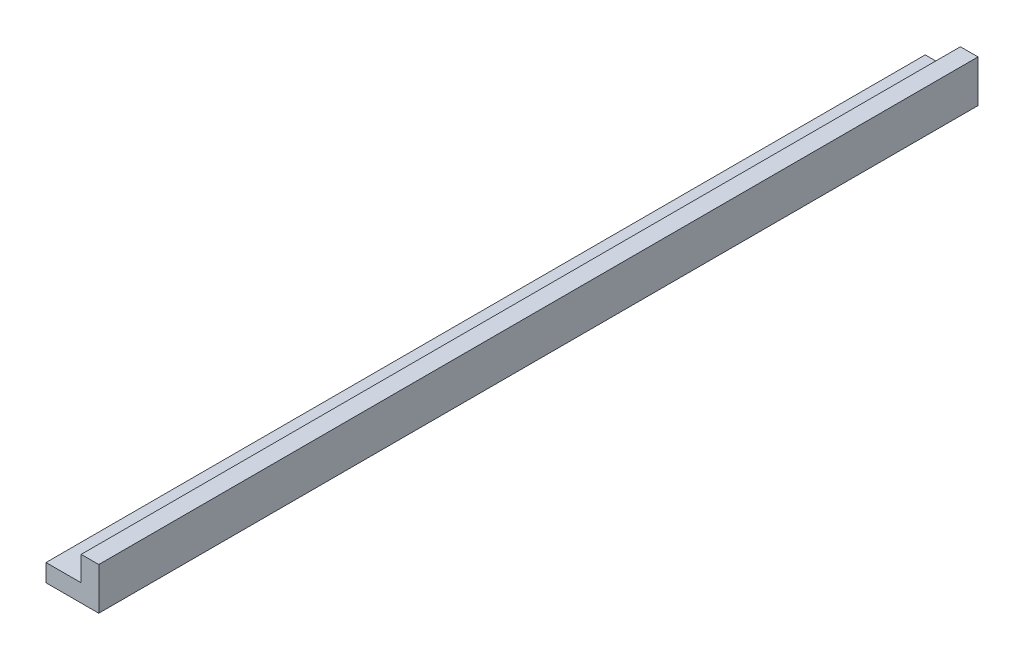
ISO-10303-21;
HEADER;
FILE_DESCRIPTION(('STEP AP214'),'2;1');
FILE_NAME('part.step','',(''),(''),'','','');
FILE_SCHEMA(('AUTOMOTIVE_DESIGN { 1 0 10303 214 1 1 1 1 }'));
ENDSEC;
DATA;
#1=APPLICATION_CONTEXT('core data for automotive mechanical design processes');
#2=APPLICATION_PROTOCOL_DEFINITION('international standard','automotive_design',2000,#1);
#3=PRODUCT_CONTEXT('',#1,'mechanical');
#4=PRODUCT('Part','Part','',(#3));
#5=PRODUCT_RELATED_PRODUCT_CATEGORY('part','',(#4));
#6=PRODUCT_DEFINITION_FORMATION('','',#4);
#7=PRODUCT_DEFINITION_CONTEXT('part definition',#1,'design');
#8=PRODUCT_DEFINITION('design','',#6,#7);
#9=PRODUCT_DEFINITION_SHAPE('','',#8);
#10=(LENGTH_UNIT() NAMED_UNIT(*) SI_UNIT(.MILLI.,.METRE.));
#11=(NAMED_UNIT(*) PLANE_ANGLE_UNIT() SI_UNIT($,.RADIAN.));
#12=(NAMED_UNIT(*) SI_UNIT($,.STERADIAN.) SOLID_ANGLE_UNIT());
#13=UNCERTAINTY_MEASURE_WITH_UNIT(LENGTH_MEASURE(1.E-05),#10,'distance_accuracy_value','');
#14=(GEOMETRIC_REPRESENTATION_CONTEXT(3) GLOBAL_UNCERTAINTY_ASSIGNED_CONTEXT((#13)) GLOBAL_UNIT_ASSIGNED_CONTEXT((#10,
#11,#12)) REPRESENTATION_CONTEXT('',''));
#15=CARTESIAN_POINT('',(0.,0.,0.));
#16=DIRECTION('',(0.,0.,1.));
#17=DIRECTION('',(1.,0.,0.));
#18=AXIS2_PLACEMENT_3D('',#15,#16,#17);
#19=CARTESIAN_POINT('',(7.49999999999999,5.,-125.));
#20=DIRECTION('',(-1.,0.,0.));
#21=DIRECTION('',(0.,0.,1.));
#22=AXIS2_PLACEMENT_3D('',#19,#20,#21);
#23=PLANE('',#22);
#24=DIRECTION('',(0.,0.,-1.));
#25=VECTOR('',#24,1.);
#26=CARTESIAN_POINT('',(7.49999999999999,0.,-125.));
#27=LINE('',#26,#25);
#28=CARTESIAN_POINT('',(7.50000000000002,0.,125.));
#29=VERTEX_POINT('',#28);
#30=CARTESIAN_POINT('',(7.49999999999999,0.,-125.));
#31=VERTEX_POINT('',#30);
#32=EDGE_CURVE('E132',#29,#31,#27,.T.);
#33=ORIENTED_EDGE('',*,*,#32,.T.);
#34=DIRECTION('',(0.,-1.,0.));
#35=VECTOR('',#34,1.);
#36=CARTESIAN_POINT('',(7.49999999999999,5.,-125.));
#37=LINE('',#36,#35);
#38=CARTESIAN_POINT('',(7.49999999999998,12.,-125.));
#39=VERTEX_POINT('',#38);
#40=EDGE_CURVE('E11',#39,#31,#37,.T.);
#41=ORIENTED_EDGE('',*,*,#40,.F.);
#42=DIRECTION('',(0.,0.,1.));
#43=VECTOR('',#42,1.);
#44=CARTESIAN_POINT('',(7.50000000000002,12.,125.));
#45=LINE('',#44,#43);
#46=CARTESIAN_POINT('',(7.50000000000002,12.,125.));
#47=VERTEX_POINT('',#46);
#48=EDGE_CURVE('E114',#39,#47,#45,.T.);
#49=ORIENTED_EDGE('',*,*,#48,.T.);
#50=DIRECTION('',(0.,-1.,0.));
#51=VECTOR('',#50,1.);
#52=CARTESIAN_POINT('',(7.50000000000002,5.,125.));
#53=LINE('',#52,#51);
#54=EDGE_CURVE('E141',#47,#29,#53,.T.);
#55=ORIENTED_EDGE('',*,*,#54,.T.);
#56=EDGE_LOOP('',(#33,#41,#49,#55));
#57=FACE_BOUND('',#56,.T.);
#58=ADVANCED_FACE('F45',(#57),#23,.F.);
#59=CARTESIAN_POINT('',(-7.50000000000001,5.,-125.));
#60=DIRECTION('',(0.,0.,1.));
#61=DIRECTION('',(1.,0.,0.));
#62=AXIS2_PLACEMENT_3D('',#59,#60,#61);
#63=PLANE('',#62);
#64=DIRECTION('',(-1.,0.,0.));
#65=VECTOR('',#64,1.);
#66=CARTESIAN_POINT('',(-7.50000000000001,5.,-125.));
#67=LINE('',#66,#65);
#68=CARTESIAN_POINT('',(2.5,5.,-125.));
#69=VERTEX_POINT('',#68);
#70=CARTESIAN_POINT('',(-7.50000000000001,5.,-125.));
#71=VERTEX_POINT('',#70);
#72=EDGE_CURVE('E102',#69,#71,#67,.T.);
#73=ORIENTED_EDGE('',*,*,#72,.F.);
#74=DIRECTION('',(0.,1.,0.));
#75=VECTOR('',#74,1.);
#76=CARTESIAN_POINT('',(2.49999999999998,0.,-125.));
#77=LINE('',#76,#75);
#78=CARTESIAN_POINT('',(2.49999999999998,12.,-125.));
#79=VERTEX_POINT('',#78);
#80=EDGE_CURVE('E96',#69,#79,#77,.T.);
#81=ORIENTED_EDGE('',*,*,#80,.T.);
#82=DIRECTION('',(1.,0.,0.));
#83=VECTOR('',#82,1.);
#84=CARTESIAN_POINT('',(2.49999999999998,12.,-125.));
#85=LINE('',#84,#83);
#86=EDGE_CURVE('E99',#79,#39,#85,.T.);
#87=ORIENTED_EDGE('',*,*,#86,.T.);
#88=ORIENTED_EDGE('',*,*,#40,.T.);
#89=DIRECTION('',(-1.,0.,0.));
#90=VECTOR('',#89,1.);
#91=CARTESIAN_POINT('',(-7.50000000000001,0.,-125.));
#92=LINE('',#91,#90);
#93=CARTESIAN_POINT('',(-7.50000000000001,0.,-125.));
#94=VERTEX_POINT('',#93);
#95=EDGE_CURVE('E145',#31,#94,#92,.T.);
#96=ORIENTED_EDGE('',*,*,#95,.T.);
#97=DIRECTION('',(0.,-1.,0.));
#98=VECTOR('',#97,1.);
#99=CARTESIAN_POINT('',(-7.50000000000001,5.,-125.));
#100=LINE('',#99,#98);
#101=EDGE_CURVE('E53',#71,#94,#100,.T.);
#102=ORIENTED_EDGE('',*,*,#101,.F.);
#103=EDGE_LOOP('',(#73,#81,#87,#88,#96,#102));
#104=FACE_BOUND('',#103,.T.);
#105=ADVANCED_FACE('F98',(#104),#63,.F.);
#106=CARTESIAN_POINT('',(-7.50000000000001,5.,-125.));
#107=DIRECTION('',(1.,0.,0.));
#108=DIRECTION('',(0.,0.,-1.));
#109=AXIS2_PLACEMENT_3D('',#106,#107,#108);
#110=PLANE('',#109);
#111=DIRECTION('',(0.,0.,1.));
#112=VECTOR('',#111,1.);
#113=CARTESIAN_POINT('',(-7.50000000000001,0.,-125.));
#114=LINE('',#113,#112);
#115=CARTESIAN_POINT('',(-7.49999999999998,0.,125.));
#116=VERTEX_POINT('',#115);
#117=EDGE_CURVE('E148',#94,#116,#114,.T.);
#118=ORIENTED_EDGE('',*,*,#117,.T.);
#119=DIRECTION('',(0.,-1.,0.));
#120=VECTOR('',#119,1.);
#121=CARTESIAN_POINT('',(-7.49999999999998,5.,125.));
#122=LINE('',#121,#120);
#123=CARTESIAN_POINT('',(-7.49999999999998,5.,125.));
#124=VERTEX_POINT('',#123);
#125=EDGE_CURVE('E156',#124,#116,#122,.T.);
#126=ORIENTED_EDGE('',*,*,#125,.F.);
#127=DIRECTION('',(0.,0.,1.));
#128=VECTOR('',#127,1.);
#129=CARTESIAN_POINT('',(-7.50000000000001,5.,-125.));
#130=LINE('',#129,#128);
#131=EDGE_CURVE('E135',#71,#124,#130,.T.);
#132=ORIENTED_EDGE('',*,*,#131,.F.);
#133=ORIENTED_EDGE('',*,*,#101,.T.);
#134=EDGE_LOOP('',(#118,#126,#132,#133));
#135=FACE_BOUND('',#134,.T.);
#136=ADVANCED_FACE('F164',(#135),#110,.F.);
#137=CARTESIAN_POINT('',(-7.49999999999998,5.,125.));
#138=DIRECTION('',(0.,0.,-1.));
#139=DIRECTION('',(-1.,0.,0.));
#140=AXIS2_PLACEMENT_3D('',#137,#138,#139);
#141=PLANE('',#140);
#142=DIRECTION('',(1.,0.,0.));
#143=VECTOR('',#142,1.);
#144=CARTESIAN_POINT('',(-7.49999999999998,0.,125.));
#145=LINE('',#144,#143);
#146=EDGE_CURVE('E136',#116,#29,#145,.T.);
#147=ORIENTED_EDGE('',*,*,#146,.T.);
#148=ORIENTED_EDGE('',*,*,#54,.F.);
#149=DIRECTION('',(1.,0.,0.));
#150=VECTOR('',#149,1.);
#151=CARTESIAN_POINT('',(2.50000000000002,12.,125.));
#152=LINE('',#151,#150);
#153=CARTESIAN_POINT('',(2.50000000000002,12.,125.));
#154=VERTEX_POINT('',#153);
#155=EDGE_CURVE('E116',#154,#47,#152,.T.);
#156=ORIENTED_EDGE('',*,*,#155,.F.);
#157=DIRECTION('',(0.,-1.,0.));
#158=VECTOR('',#157,1.);
#159=CARTESIAN_POINT('',(2.50000000000002,0.,125.));
#160=LINE('',#159,#158);
#161=CARTESIAN_POINT('',(2.5,5.,125.));
#162=VERTEX_POINT('',#161);
#163=EDGE_CURVE('E107',#154,#162,#160,.T.);
#164=ORIENTED_EDGE('',*,*,#163,.T.);
#165=DIRECTION('',(1.,0.,0.));
#166=VECTOR('',#165,1.);
#167=CARTESIAN_POINT('',(-7.49999999999998,5.,125.));
#168=LINE('',#167,#166);
#169=EDGE_CURVE('E60',#124,#162,#168,.T.);
#170=ORIENTED_EDGE('',*,*,#169,.F.);
#171=ORIENTED_EDGE('',*,*,#125,.T.);
#172=EDGE_LOOP('',(#147,#148,#156,#164,#170,#171));
#173=FACE_BOUND('',#172,.T.);
#174=ADVANCED_FACE('F171',(#173),#141,.F.);
#175=CARTESIAN_POINT('',(0.,5.,0.));
#176=DIRECTION('',(0.,1.,0.));
#177=DIRECTION('',(0.,0.,1.));
#178=AXIS2_PLACEMENT_3D('',#175,#176,#177);
#179=PLANE('',#178);
#180=CARTESIAN_POINT('',(-2.50000000000001,5.,-100.));
#181=DIRECTION('',(0.,1.,0.));
#182=DIRECTION('',(0.,0.,1.));
#183=AXIS2_PLACEMENT_3D('',#180,#181,#182);
#184=CIRCLE('',#183,1.75);
#185=CARTESIAN_POINT('',(-2.50000000000001,5.,-98.25));
#186=VERTEX_POINT('',#185);
#187=EDGE_CURVE('E213',#186,#186,#184,.T.);
#188=ORIENTED_EDGE('',*,*,#187,.F.);
#189=EDGE_LOOP('',(#188));
#190=FACE_BOUND('',#189,.T.);
#191=CARTESIAN_POINT('',(-2.50000000000001,5.,0.));
#192=DIRECTION('',(0.,1.,0.));
#193=DIRECTION('',(0.,0.,1.));
#194=AXIS2_PLACEMENT_3D('',#191,#192,#193);
#195=CIRCLE('',#194,1.75);
#196=CARTESIAN_POINT('',(-2.50000000000001,5.,1.75));
#197=VERTEX_POINT('',#196);
#198=EDGE_CURVE('E215',#197,#197,#195,.T.);
#199=ORIENTED_EDGE('',*,*,#198,.F.);
#200=EDGE_LOOP('',(#199));
#201=FACE_BOUND('',#200,.T.);
#202=CARTESIAN_POINT('',(-2.50000000000001,5.,100.));
#203=DIRECTION('',(0.,1.,0.));
#204=DIRECTION('',(0.,0.,1.));
#205=AXIS2_PLACEMENT_3D('',#202,#203,#204);
#206=CIRCLE('',#205,1.75);
#207=CARTESIAN_POINT('',(-2.50000000000001,5.,101.75));
#208=VERTEX_POINT('',#207);
#209=EDGE_CURVE('E227',#208,#208,#206,.T.);
#210=ORIENTED_EDGE('',*,*,#209,.F.);
#211=EDGE_LOOP('',(#210));
#212=FACE_BOUND('',#211,.T.);
#213=DIRECTION('',(0.,0.,1.));
#214=VECTOR('',#213,1.);
#215=CARTESIAN_POINT('',(2.5,5.,0.));
#216=LINE('',#215,#214);
#217=EDGE_CURVE('E64',#69,#162,#216,.T.);
#218=ORIENTED_EDGE('',*,*,#217,.F.);
#219=ORIENTED_EDGE('',*,*,#72,.T.);
#220=ORIENTED_EDGE('',*,*,#131,.T.);
#221=ORIENTED_EDGE('',*,*,#169,.T.);
#222=EDGE_LOOP('',(#218,#219,#220,#221));
#223=FACE_BOUND('',#222,.T.);
#224=ADVANCED_FACE('F184',(#190,#201,#212,#223),#179,.T.);
#225=CARTESIAN_POINT('',(0.,0.,0.));
#226=DIRECTION('',(0.,1.,0.));
#227=DIRECTION('',(0.,0.,1.));
#228=AXIS2_PLACEMENT_3D('',#225,#226,#227);
#229=PLANE('',#228);
#230=CARTESIAN_POINT('',(-2.50000000000001,0.,-100.));
#231=DIRECTION('',(0.,1.,0.));
#232=DIRECTION('',(0.,0.,1.));
#233=AXIS2_PLACEMENT_3D('',#230,#231,#232);
#234=CIRCLE('',#233,1.75);
#235=CARTESIAN_POINT('',(-2.50000000000001,0.,-98.25));
#236=VERTEX_POINT('',#235);
#237=EDGE_CURVE('E127',#236,#236,#234,.T.);
#238=ORIENTED_EDGE('',*,*,#237,.T.);
#239=EDGE_LOOP('',(#238));
#240=FACE_BOUND('',#239,.T.);
#241=CARTESIAN_POINT('',(-2.50000000000001,0.,0.));
#242=DIRECTION('',(0.,1.,0.));
#243=DIRECTION('',(0.,0.,1.));
#244=AXIS2_PLACEMENT_3D('',#241,#242,#243);
#245=CIRCLE('',#244,1.75);
#246=CARTESIAN_POINT('',(-2.50000000000001,0.,1.75));
#247=VERTEX_POINT('',#246);
#248=EDGE_CURVE('E221',#247,#247,#245,.T.);
#249=ORIENTED_EDGE('',*,*,#248,.T.);
#250=EDGE_LOOP('',(#249));
#251=FACE_BOUND('',#250,.T.);
#252=CARTESIAN_POINT('',(-2.50000000000001,0.,100.));
#253=DIRECTION('',(0.,1.,0.));
#254=DIRECTION('',(0.,0.,1.));
#255=AXIS2_PLACEMENT_3D('',#252,#253,#254);
#256=CIRCLE('',#255,1.75);
#257=CARTESIAN_POINT('',(-2.50000000000001,0.,101.75));
#258=VERTEX_POINT('',#257);
#259=EDGE_CURVE('E231',#258,#258,#256,.T.);
#260=ORIENTED_EDGE('',*,*,#259,.T.);
#261=EDGE_LOOP('',(#260));
#262=FACE_BOUND('',#261,.T.);
#263=ORIENTED_EDGE('',*,*,#117,.F.);
#264=ORIENTED_EDGE('',*,*,#95,.F.);
#265=ORIENTED_EDGE('',*,*,#32,.F.);
#266=ORIENTED_EDGE('',*,*,#146,.F.);
#267=EDGE_LOOP('',(#263,#264,#265,#266));
#268=FACE_BOUND('',#267,.T.);
#269=ADVANCED_FACE('F168',(#240,#251,#262,#268),#229,.F.);
#270=CARTESIAN_POINT('',(2.50000000000002,12.,125.));
#271=DIRECTION('',(0.,1.,0.));
#272=DIRECTION('',(0.,0.,1.));
#273=AXIS2_PLACEMENT_3D('',#270,#271,#272);
#274=PLANE('',#273);
#275=ORIENTED_EDGE('',*,*,#48,.F.);
#276=ORIENTED_EDGE('',*,*,#86,.F.);
#277=DIRECTION('',(0.,0.,1.));
#278=VECTOR('',#277,1.);
#279=CARTESIAN_POINT('',(2.50000000000002,12.,125.));
#280=LINE('',#279,#278);
#281=EDGE_CURVE('E106',#79,#154,#280,.T.);
#282=ORIENTED_EDGE('',*,*,#281,.T.);
#283=ORIENTED_EDGE('',*,*,#155,.T.);
#284=EDGE_LOOP('',(#275,#276,#282,#283));
#285=FACE_BOUND('',#284,.T.);
#286=ADVANCED_FACE('F111',(#285),#274,.T.);
#287=CARTESIAN_POINT('',(2.5,0.,0.));
#288=DIRECTION('',(-1.,0.,0.));
#289=DIRECTION('',(0.,0.,1.));
#290=AXIS2_PLACEMENT_3D('',#287,#288,#289);
#291=PLANE('',#290);
#292=ORIENTED_EDGE('',*,*,#80,.F.);
#293=ORIENTED_EDGE('',*,*,#217,.T.);
#294=ORIENTED_EDGE('',*,*,#163,.F.);
#295=ORIENTED_EDGE('',*,*,#281,.F.);
#296=EDGE_LOOP('',(#292,#293,#294,#295));
#297=FACE_BOUND('',#296,.T.);
#298=ADVANCED_FACE('F119',(#297),#291,.T.);
#299=CARTESIAN_POINT('',(-2.50000000000001,0.,100.));
#300=DIRECTION('',(0.,1.,0.));
#301=DIRECTION('',(0.,0.,1.));
#302=AXIS2_PLACEMENT_3D('',#299,#300,#301);
#303=CYLINDRICAL_SURFACE('',#302,1.75);
#304=ORIENTED_EDGE('',*,*,#259,.F.);
#305=EDGE_LOOP('',(#304));
#306=FACE_BOUND('',#305,.T.);
#307=ORIENTED_EDGE('',*,*,#209,.T.);
#308=EDGE_LOOP('',(#307));
#309=FACE_BOUND('',#308,.T.);
#310=ADVANCED_FACE('F195',(#306,#309),#303,.F.);
#311=CARTESIAN_POINT('',(-2.50000000000001,0.,0.));
#312=DIRECTION('',(0.,1.,0.));
#313=DIRECTION('',(0.,0.,1.));
#314=AXIS2_PLACEMENT_3D('',#311,#312,#313);
#315=CYLINDRICAL_SURFACE('',#314,1.75);
#316=ORIENTED_EDGE('',*,*,#248,.F.);
#317=EDGE_LOOP('',(#316));
#318=FACE_BOUND('',#317,.T.);
#319=ORIENTED_EDGE('',*,*,#198,.T.);
#320=EDGE_LOOP('',(#319));
#321=FACE_BOUND('',#320,.T.);
#322=ADVANCED_FACE('F198',(#318,#321),#315,.F.);
#323=CARTESIAN_POINT('',(-2.50000000000001,0.,-100.));
#324=DIRECTION('',(0.,1.,0.));
#325=DIRECTION('',(0.,0.,1.));
#326=AXIS2_PLACEMENT_3D('',#323,#324,#325);
#327=CYLINDRICAL_SURFACE('',#326,1.75);
#328=ORIENTED_EDGE('',*,*,#237,.F.);
#329=EDGE_LOOP('',(#328));
#330=FACE_BOUND('',#329,.T.);
#331=ORIENTED_EDGE('',*,*,#187,.T.);
#332=EDGE_LOOP('',(#331));
#333=FACE_BOUND('',#332,.T.);
#334=ADVANCED_FACE('F202',(#330,#333),#327,.F.);
#335=CLOSED_SHELL('',(#58,#105,#136,#174,#224,#269,#286,#298,#310,#322,#334));
#336=MANIFOLD_SOLID_BREP('B2',#335);
#337=ADVANCED_BREP_SHAPE_REPRESENTATION('',(#18,#336),#14);
#338=SHAPE_DEFINITION_REPRESENTATION(#9,#337);
ENDSEC;
END-ISO-10303-21;
